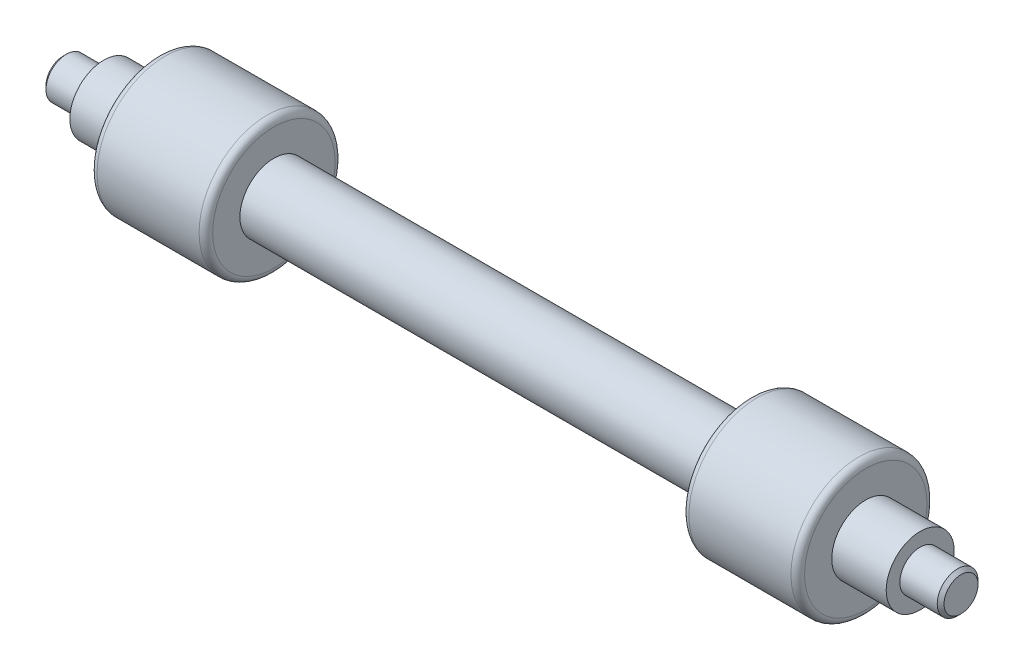
ISO-10303-21;
HEADER;
FILE_DESCRIPTION(('STEP AP214'),'2;1');
FILE_NAME('part.step','',(''),(''),'','','');
FILE_SCHEMA(('AUTOMOTIVE_DESIGN { 1 0 10303 214 1 1 1 1 }'));
ENDSEC;
DATA;
#1=APPLICATION_CONTEXT('core data for automotive mechanical design processes');
#2=APPLICATION_PROTOCOL_DEFINITION('international standard','automotive_design',2000,#1);
#3=PRODUCT_CONTEXT('',#1,'mechanical');
#4=PRODUCT('Part','Part','',(#3));
#5=PRODUCT_RELATED_PRODUCT_CATEGORY('part','',(#4));
#6=PRODUCT_DEFINITION_FORMATION('','',#4);
#7=PRODUCT_DEFINITION_CONTEXT('part definition',#1,'design');
#8=PRODUCT_DEFINITION('design','',#6,#7);
#9=PRODUCT_DEFINITION_SHAPE('','',#8);
#10=(LENGTH_UNIT() NAMED_UNIT(*) SI_UNIT(.MILLI.,.METRE.));
#11=(NAMED_UNIT(*) PLANE_ANGLE_UNIT() SI_UNIT($,.RADIAN.));
#12=(NAMED_UNIT(*) SI_UNIT($,.STERADIAN.) SOLID_ANGLE_UNIT());
#13=UNCERTAINTY_MEASURE_WITH_UNIT(LENGTH_MEASURE(1.E-05),#10,'distance_accuracy_value','');
#14=(GEOMETRIC_REPRESENTATION_CONTEXT(3) GLOBAL_UNCERTAINTY_ASSIGNED_CONTEXT((#13)) GLOBAL_UNIT_ASSIGNED_CONTEXT((#10,
#11,#12)) REPRESENTATION_CONTEXT('',''));
#15=CARTESIAN_POINT('',(0.,0.,0.));
#16=DIRECTION('',(0.,0.,1.));
#17=DIRECTION('',(1.,0.,0.));
#18=AXIS2_PLACEMENT_3D('',#15,#16,#17);
#19=CARTESIAN_POINT('',(-35.8089771432617,0.,0.));
#20=DIRECTION('',(-1.,0.,0.));
#21=DIRECTION('',(0.,0.,1.));
#22=AXIS2_PLACEMENT_3D('',#19,#20,#21);
#23=CYLINDRICAL_SURFACE('',#22,2.5);
#24=CARTESIAN_POINT('',(26.,0.,0.));
#25=DIRECTION('',(-1.,0.,0.));
#26=DIRECTION('',(0.,0.,1.));
#27=AXIS2_PLACEMENT_3D('',#24,#25,#26);
#28=CIRCLE('',#27,2.5);
#29=CARTESIAN_POINT('',(26.,0.,2.5));
#30=VERTEX_POINT('',#29);
#31=EDGE_CURVE('E79',#30,#30,#28,.T.);
#32=ORIENTED_EDGE('',*,*,#31,.F.);
#33=EDGE_LOOP('',(#32));
#34=FACE_BOUND('',#33,.T.);
#35=CARTESIAN_POINT('',(17.5,0.,0.));
#36=DIRECTION('',(-1.,0.,0.));
#37=DIRECTION('',(0.,0.,1.));
#38=AXIS2_PLACEMENT_3D('',#35,#36,#37);
#39=CIRCLE('',#38,2.5);
#40=CARTESIAN_POINT('',(17.5,0.,2.5));
#41=VERTEX_POINT('',#40);
#42=EDGE_CURVE('E76',#41,#41,#39,.T.);
#43=ORIENTED_EDGE('',*,*,#42,.T.);
#44=EDGE_LOOP('',(#43));
#45=FACE_BOUND('',#44,.T.);
#46=ADVANCED_FACE('F56',(#34,#45),#23,.F.);
#47=CARTESIAN_POINT('',(17.5,2.5,0.));
#48=DIRECTION('',(1.,0.,0.));
#49=DIRECTION('',(0.,0.,-1.));
#50=AXIS2_PLACEMENT_3D('',#47,#48,#49);
#51=PLANE('',#50);
#52=CARTESIAN_POINT('',(17.5,0.,0.));
#53=DIRECTION('',(1.,0.,0.));
#54=DIRECTION('',(0.,0.,-1.));
#55=AXIS2_PLACEMENT_3D('',#52,#53,#54);
#56=CIRCLE('',#55,4.5);
#57=CARTESIAN_POINT('',(17.5,0.,-4.5));
#58=VERTEX_POINT('',#57);
#59=EDGE_CURVE('E71',#58,#58,#56,.F.);
#60=ORIENTED_EDGE('',*,*,#59,.T.);
#61=EDGE_LOOP('',(#60));
#62=FACE_BOUND('',#61,.T.);
#63=ORIENTED_EDGE('',*,*,#42,.F.);
#64=EDGE_LOOP('',(#63));
#65=FACE_BOUND('',#64,.T.);
#66=ADVANCED_FACE('F87',(#62,#65),#51,.F.);
#67=CARTESIAN_POINT('',(-35.8089771432617,0.,0.));
#68=DIRECTION('',(-1.,0.,0.));
#69=DIRECTION('',(0.,0.,1.));
#70=AXIS2_PLACEMENT_3D('',#67,#68,#69);
#71=CYLINDRICAL_SURFACE('',#70,5.);
#72=CARTESIAN_POINT('',(18.,0.,0.));
#73=DIRECTION('',(1.,0.,0.));
#74=DIRECTION('',(0.,0.,-1.));
#75=AXIS2_PLACEMENT_3D('',#72,#73,#74);
#76=CIRCLE('',#75,5.);
#77=CARTESIAN_POINT('',(18.,0.,-5.));
#78=VERTEX_POINT('',#77);
#79=EDGE_CURVE('E63',#78,#78,#76,.T.);
#80=ORIENTED_EDGE('',*,*,#79,.T.);
#81=EDGE_LOOP('',(#80));
#82=FACE_BOUND('',#81,.T.);
#83=CARTESIAN_POINT('',(25.5,0.,0.));
#84=DIRECTION('',(-1.,0.,0.));
#85=DIRECTION('',(0.,0.,1.));
#86=AXIS2_PLACEMENT_3D('',#83,#84,#85);
#87=CIRCLE('',#86,5.);
#88=CARTESIAN_POINT('',(25.5,0.,5.));
#89=VERTEX_POINT('',#88);
#90=EDGE_CURVE('E67',#89,#89,#87,.T.);
#91=ORIENTED_EDGE('',*,*,#90,.T.);
#92=EDGE_LOOP('',(#91));
#93=FACE_BOUND('',#92,.T.);
#94=ADVANCED_FACE('F92',(#82,#93),#71,.T.);
#95=CARTESIAN_POINT('',(26.,5.,0.));
#96=DIRECTION('',(-1.,0.,0.));
#97=DIRECTION('',(0.,0.,1.));
#98=AXIS2_PLACEMENT_3D('',#95,#96,#97);
#99=PLANE('',#98);
#100=CARTESIAN_POINT('',(26.,0.,0.));
#101=DIRECTION('',(-1.,0.,0.));
#102=DIRECTION('',(0.,0.,1.));
#103=AXIS2_PLACEMENT_3D('',#100,#101,#102);
#104=CIRCLE('',#103,4.5);
#105=CARTESIAN_POINT('',(26.,0.,4.5));
#106=VERTEX_POINT('',#105);
#107=EDGE_CURVE('E11',#106,#106,#104,.F.);
#108=ORIENTED_EDGE('',*,*,#107,.T.);
#109=EDGE_LOOP('',(#108));
#110=FACE_BOUND('',#109,.T.);
#111=ORIENTED_EDGE('',*,*,#31,.T.);
#112=EDGE_LOOP('',(#111));
#113=FACE_BOUND('',#112,.T.);
#114=ADVANCED_FACE('F83',(#110,#113),#99,.F.);
#115=CARTESIAN_POINT('',(18.,0.,0.));
#116=DIRECTION('',(1.,0.,0.));
#117=DIRECTION('',(0.,0.,-1.));
#118=AXIS2_PLACEMENT_3D('',#115,#116,#117);
#119=TOROIDAL_SURFACE('',#118,4.5,0.5);
#120=ORIENTED_EDGE('',*,*,#79,.F.);
#121=EDGE_LOOP('',(#120));
#122=FACE_BOUND('',#121,.T.);
#123=ORIENTED_EDGE('',*,*,#59,.F.);
#124=EDGE_LOOP('',(#123));
#125=FACE_BOUND('',#124,.T.);
#126=ADVANCED_FACE('F100',(#122,#125),#119,.T.);
#127=CARTESIAN_POINT('',(25.5,0.,0.));
#128=DIRECTION('',(-1.,0.,0.));
#129=DIRECTION('',(0.,0.,1.));
#130=AXIS2_PLACEMENT_3D('',#127,#128,#129);
#131=TOROIDAL_SURFACE('',#130,4.5,0.5);
#132=ORIENTED_EDGE('',*,*,#107,.F.);
#133=EDGE_LOOP('',(#132));
#134=FACE_BOUND('',#133,.T.);
#135=ORIENTED_EDGE('',*,*,#90,.F.);
#136=EDGE_LOOP('',(#135));
#137=FACE_BOUND('',#136,.T.);
#138=ADVANCED_FACE('F58',(#134,#137),#131,.T.);
#139=CLOSED_SHELL('',(#46,#66,#94,#114,#126,#138));
#140=MANIFOLD_SOLID_BREP('B2',#139);
#141=CARTESIAN_POINT('',(-35.8089771432617,0.,0.));
#142=DIRECTION('',(-1.,0.,0.));
#143=DIRECTION('',(0.,0.,1.));
#144=AXIS2_PLACEMENT_3D('',#141,#142,#143);
#145=CYLINDRICAL_SURFACE('',#144,2.5);
#146=CARTESIAN_POINT('',(-17.5,0.,0.));
#147=DIRECTION('',(-1.,0.,0.));
#148=DIRECTION('',(0.,0.,1.));
#149=AXIS2_PLACEMENT_3D('',#146,#147,#148);
#150=CIRCLE('',#149,2.5);
#151=CARTESIAN_POINT('',(-17.5,0.,2.5));
#152=VERTEX_POINT('',#151);
#153=EDGE_CURVE('E190',#152,#152,#150,.T.);
#154=ORIENTED_EDGE('',*,*,#153,.F.);
#155=EDGE_LOOP('',(#154));
#156=FACE_BOUND('',#155,.T.);
#157=CARTESIAN_POINT('',(-26.,0.,0.));
#158=DIRECTION('',(-1.,0.,0.));
#159=DIRECTION('',(0.,0.,1.));
#160=AXIS2_PLACEMENT_3D('',#157,#158,#159);
#161=CIRCLE('',#160,2.5);
#162=CARTESIAN_POINT('',(-26.,0.,2.5));
#163=VERTEX_POINT('',#162);
#164=EDGE_CURVE('E187',#163,#163,#161,.T.);
#165=ORIENTED_EDGE('',*,*,#164,.T.);
#166=EDGE_LOOP('',(#165));
#167=FACE_BOUND('',#166,.T.);
#168=ADVANCED_FACE('F167',(#156,#167),#145,.F.);
#169=CARTESIAN_POINT('',(-26.,2.5,0.));
#170=DIRECTION('',(1.,0.,0.));
#171=DIRECTION('',(0.,0.,-1.));
#172=AXIS2_PLACEMENT_3D('',#169,#170,#171);
#173=PLANE('',#172);
#174=CARTESIAN_POINT('',(-26.,0.,0.));
#175=DIRECTION('',(1.,0.,0.));
#176=DIRECTION('',(0.,0.,-1.));
#177=AXIS2_PLACEMENT_3D('',#174,#175,#176);
#178=CIRCLE('',#177,4.5);
#179=CARTESIAN_POINT('',(-26.,0.,-4.5));
#180=VERTEX_POINT('',#179);
#181=EDGE_CURVE('E55',#180,#180,#178,.F.);
#182=ORIENTED_EDGE('',*,*,#181,.T.);
#183=EDGE_LOOP('',(#182));
#184=FACE_BOUND('',#183,.T.);
#185=ORIENTED_EDGE('',*,*,#164,.F.);
#186=EDGE_LOOP('',(#185));
#187=FACE_BOUND('',#186,.T.);
#188=ADVANCED_FACE('F198',(#184,#187),#173,.F.);
#189=CARTESIAN_POINT('',(-35.8089771432617,0.,0.));
#190=DIRECTION('',(-1.,0.,0.));
#191=DIRECTION('',(0.,0.,1.));
#192=AXIS2_PLACEMENT_3D('',#189,#190,#191);
#193=CYLINDRICAL_SURFACE('',#192,5.);
#194=CARTESIAN_POINT('',(-18.,0.,0.));
#195=DIRECTION('',(-1.,0.,0.));
#196=DIRECTION('',(0.,0.,1.));
#197=AXIS2_PLACEMENT_3D('',#194,#195,#196);
#198=CIRCLE('',#197,5.);
#199=CARTESIAN_POINT('',(-18.,0.,5.));
#200=VERTEX_POINT('',#199);
#201=EDGE_CURVE('E178',#200,#200,#198,.T.);
#202=ORIENTED_EDGE('',*,*,#201,.T.);
#203=EDGE_LOOP('',(#202));
#204=FACE_BOUND('',#203,.T.);
#205=CARTESIAN_POINT('',(-25.5,0.,0.));
#206=DIRECTION('',(1.,0.,0.));
#207=DIRECTION('',(0.,0.,-1.));
#208=AXIS2_PLACEMENT_3D('',#205,#206,#207);
#209=CIRCLE('',#208,5.);
#210=CARTESIAN_POINT('',(-25.5,0.,-5.));
#211=VERTEX_POINT('',#210);
#212=EDGE_CURVE('E182',#211,#211,#209,.T.);
#213=ORIENTED_EDGE('',*,*,#212,.T.);
#214=EDGE_LOOP('',(#213));
#215=FACE_BOUND('',#214,.T.);
#216=ADVANCED_FACE('F203',(#204,#215),#193,.T.);
#217=CARTESIAN_POINT('',(-17.5,5.,0.));
#218=DIRECTION('',(-1.,0.,0.));
#219=DIRECTION('',(0.,0.,1.));
#220=AXIS2_PLACEMENT_3D('',#217,#218,#219);
#221=PLANE('',#220);
#222=CARTESIAN_POINT('',(-17.5,0.,0.));
#223=DIRECTION('',(-1.,0.,0.));
#224=DIRECTION('',(0.,0.,1.));
#225=AXIS2_PLACEMENT_3D('',#222,#223,#224);
#226=CIRCLE('',#225,4.5);
#227=CARTESIAN_POINT('',(-17.5,0.,4.5));
#228=VERTEX_POINT('',#227);
#229=EDGE_CURVE('E174',#228,#228,#226,.F.);
#230=ORIENTED_EDGE('',*,*,#229,.T.);
#231=EDGE_LOOP('',(#230));
#232=FACE_BOUND('',#231,.T.);
#233=ORIENTED_EDGE('',*,*,#153,.T.);
#234=EDGE_LOOP('',(#233));
#235=FACE_BOUND('',#234,.T.);
#236=ADVANCED_FACE('F194',(#232,#235),#221,.F.);
#237=CARTESIAN_POINT('',(-18.,0.,0.));
#238=DIRECTION('',(-1.,0.,0.));
#239=DIRECTION('',(0.,0.,1.));
#240=AXIS2_PLACEMENT_3D('',#237,#238,#239);
#241=TOROIDAL_SURFACE('',#240,4.5,0.5);
#242=ORIENTED_EDGE('',*,*,#229,.F.);
#243=EDGE_LOOP('',(#242));
#244=FACE_BOUND('',#243,.T.);
#245=ORIENTED_EDGE('',*,*,#201,.F.);
#246=EDGE_LOOP('',(#245));
#247=FACE_BOUND('',#246,.T.);
#248=ADVANCED_FACE('F211',(#244,#247),#241,.T.);
#249=CARTESIAN_POINT('',(-25.5,0.,0.));
#250=DIRECTION('',(1.,0.,0.));
#251=DIRECTION('',(0.,0.,-1.));
#252=AXIS2_PLACEMENT_3D('',#249,#250,#251);
#253=TOROIDAL_SURFACE('',#252,4.5,0.5);
#254=ORIENTED_EDGE('',*,*,#212,.F.);
#255=EDGE_LOOP('',(#254));
#256=FACE_BOUND('',#255,.T.);
#257=ORIENTED_EDGE('',*,*,#181,.F.);
#258=EDGE_LOOP('',(#257));
#259=FACE_BOUND('',#258,.T.);
#260=ADVANCED_FACE('F169',(#256,#259),#253,.T.);
#261=CLOSED_SHELL('',(#168,#188,#216,#236,#248,#260));
#262=MANIFOLD_SOLID_BREP('B6',#261);
#263=CARTESIAN_POINT('',(33.,0.,0.));
#264=DIRECTION('',(-1.,0.,0.));
#265=DIRECTION('',(0.,0.,1.));
#266=AXIS2_PLACEMENT_3D('',#263,#264,#265);
#267=PLANE('',#266);
#268=CARTESIAN_POINT('',(33.,0.,0.));
#269=DIRECTION('',(-1.,0.,0.));
#270=DIRECTION('',(0.,0.,1.));
#271=AXIS2_PLACEMENT_3D('',#268,#269,#270);
#272=CIRCLE('',#271,1.24999999999999);
#273=CARTESIAN_POINT('',(33.,0.,1.24999999999999));
#274=VERTEX_POINT('',#273);
#275=EDGE_CURVE('E284',#274,#274,#272,.F.);
#276=ORIENTED_EDGE('',*,*,#275,.T.);
#277=EDGE_LOOP('',(#276));
#278=FACE_BOUND('',#277,.T.);
#279=ADVANCED_FACE('F270',(#278),#267,.F.);
#280=CARTESIAN_POINT('',(-35.8089771432617,0.,0.));
#281=DIRECTION('',(-1.,0.,0.));
#282=DIRECTION('',(0.,0.,1.));
#283=AXIS2_PLACEMENT_3D('',#280,#281,#282);
#284=CYLINDRICAL_SURFACE('',#283,1.5);
#285=CARTESIAN_POINT('',(32.75,0.,0.));
#286=DIRECTION('',(-1.,0.,0.));
#287=DIRECTION('',(0.,0.,1.));
#288=AXIS2_PLACEMENT_3D('',#285,#286,#287);
#289=CIRCLE('',#288,1.5);
#290=CARTESIAN_POINT('',(32.75,0.,1.5));
#291=VERTEX_POINT('',#290);
#292=EDGE_CURVE('E289',#291,#291,#289,.T.);
#293=ORIENTED_EDGE('',*,*,#292,.T.);
#294=EDGE_LOOP('',(#293));
#295=FACE_BOUND('',#294,.T.);
#296=CARTESIAN_POINT('',(30.,0.,0.));
#297=DIRECTION('',(-1.,0.,0.));
#298=DIRECTION('',(0.,0.,1.));
#299=AXIS2_PLACEMENT_3D('',#296,#297,#298);
#300=CIRCLE('',#299,1.5);
#301=CARTESIAN_POINT('',(30.,0.,1.5));
#302=VERTEX_POINT('',#301);
#303=EDGE_CURVE('E295',#302,#302,#300,.T.);
#304=ORIENTED_EDGE('',*,*,#303,.F.);
#305=EDGE_LOOP('',(#304));
#306=FACE_BOUND('',#305,.T.);
#307=ADVANCED_FACE('F329',(#295,#306),#284,.T.);
#308=CARTESIAN_POINT('',(30.,1.5,0.));
#309=DIRECTION('',(-1.,0.,0.));
#310=DIRECTION('',(0.,0.,1.));
#311=AXIS2_PLACEMENT_3D('',#308,#309,#310);
#312=PLANE('',#311);
#313=CARTESIAN_POINT('',(30.,0.,0.));
#314=DIRECTION('',(-1.,0.,0.));
#315=DIRECTION('',(0.,0.,1.));
#316=AXIS2_PLACEMENT_3D('',#313,#314,#315);
#317=CIRCLE('',#316,2.5);
#318=CARTESIAN_POINT('',(30.,0.,2.5));
#319=VERTEX_POINT('',#318);
#320=EDGE_CURVE('E299',#319,#319,#317,.T.);
#321=ORIENTED_EDGE('',*,*,#320,.F.);
#322=EDGE_LOOP('',(#321));
#323=FACE_BOUND('',#322,.T.);
#324=ORIENTED_EDGE('',*,*,#303,.T.);
#325=EDGE_LOOP('',(#324));
#326=FACE_BOUND('',#325,.T.);
#327=ADVANCED_FACE('F323',(#323,#326),#312,.F.);
#328=CARTESIAN_POINT('',(-35.8089771432617,0.,0.));
#329=DIRECTION('',(-1.,0.,0.));
#330=DIRECTION('',(0.,0.,1.));
#331=AXIS2_PLACEMENT_3D('',#328,#329,#330);
#332=CYLINDRICAL_SURFACE('',#331,2.5);
#333=CARTESIAN_POINT('',(-30.,0.,0.));
#334=DIRECTION('',(-1.,0.,0.));
#335=DIRECTION('',(0.,0.,1.));
#336=AXIS2_PLACEMENT_3D('',#333,#334,#335);
#337=CIRCLE('',#336,2.5);
#338=CARTESIAN_POINT('',(-30.,0.,2.5));
#339=VERTEX_POINT('',#338);
#340=EDGE_CURVE('E303',#339,#339,#337,.T.);
#341=ORIENTED_EDGE('',*,*,#340,.F.);
#342=EDGE_LOOP('',(#341));
#343=FACE_BOUND('',#342,.T.);
#344=ORIENTED_EDGE('',*,*,#320,.T.);
#345=EDGE_LOOP('',(#344));
#346=FACE_BOUND('',#345,.T.);
#347=ADVANCED_FACE('F317',(#343,#346),#332,.T.);
#348=CARTESIAN_POINT('',(-30.,2.5,0.));
#349=DIRECTION('',(1.,0.,0.));
#350=DIRECTION('',(0.,0.,-1.));
#351=AXIS2_PLACEMENT_3D('',#348,#349,#350);
#352=PLANE('',#351);
#353=CARTESIAN_POINT('',(-30.,0.,0.));
#354=DIRECTION('',(-1.,0.,0.));
#355=DIRECTION('',(0.,0.,1.));
#356=AXIS2_PLACEMENT_3D('',#353,#354,#355);
#357=CIRCLE('',#356,1.5);
#358=CARTESIAN_POINT('',(-30.,0.,1.5));
#359=VERTEX_POINT('',#358);
#360=EDGE_CURVE('E307',#359,#359,#357,.T.);
#361=ORIENTED_EDGE('',*,*,#360,.F.);
#362=EDGE_LOOP('',(#361));
#363=FACE_BOUND('',#362,.T.);
#364=ORIENTED_EDGE('',*,*,#340,.T.);
#365=EDGE_LOOP('',(#364));
#366=FACE_BOUND('',#365,.T.);
#367=ADVANCED_FACE('F314',(#363,#366),#352,.F.);
#368=CARTESIAN_POINT('',(-35.8089771432617,0.,0.));
#369=DIRECTION('',(-1.,0.,0.));
#370=DIRECTION('',(0.,0.,1.));
#371=AXIS2_PLACEMENT_3D('',#368,#369,#370);
#372=CYLINDRICAL_SURFACE('',#371,1.5);
#373=CARTESIAN_POINT('',(-32.75,0.,0.));
#374=DIRECTION('',(1.,0.,0.));
#375=DIRECTION('',(0.,0.,-1.));
#376=AXIS2_PLACEMENT_3D('',#373,#374,#375);
#377=CIRCLE('',#376,1.5);
#378=CARTESIAN_POINT('',(-32.75,0.,-1.5));
#379=VERTEX_POINT('',#378);
#380=EDGE_CURVE('E166',#379,#379,#377,.T.);
#381=ORIENTED_EDGE('',*,*,#380,.T.);
#382=EDGE_LOOP('',(#381));
#383=FACE_BOUND('',#382,.T.);
#384=ORIENTED_EDGE('',*,*,#360,.T.);
#385=EDGE_LOOP('',(#384));
#386=FACE_BOUND('',#385,.T.);
#387=ADVANCED_FACE('F312',(#383,#386),#372,.T.);
#388=CARTESIAN_POINT('',(-33.,1.5,0.));
#389=DIRECTION('',(1.,0.,0.));
#390=DIRECTION('',(0.,0.,-1.));
#391=AXIS2_PLACEMENT_3D('',#388,#389,#390);
#392=PLANE('',#391);
#393=CARTESIAN_POINT('',(-33.,0.,0.));
#394=DIRECTION('',(1.,0.,0.));
#395=DIRECTION('',(0.,0.,-1.));
#396=AXIS2_PLACEMENT_3D('',#393,#394,#395);
#397=CIRCLE('',#396,1.25000000000002);
#398=CARTESIAN_POINT('',(-33.,0.,-1.25000000000002));
#399=VERTEX_POINT('',#398);
#400=EDGE_CURVE('E279',#399,#399,#397,.F.);
#401=ORIENTED_EDGE('',*,*,#400,.T.);
#402=EDGE_LOOP('',(#401));
#403=FACE_BOUND('',#402,.T.);
#404=ADVANCED_FACE('F346',(#403),#392,.F.);
#405=CARTESIAN_POINT('',(32.75,0.,0.));
#406=DIRECTION('',(-1.,0.,0.));
#407=DIRECTION('',(0.,0.,1.));
#408=AXIS2_PLACEMENT_3D('',#405,#406,#407);
#409=CONICAL_SURFACE('',#408,1.5,0.78539816339745);
#410=ORIENTED_EDGE('',*,*,#275,.F.);
#411=EDGE_LOOP('',(#410));
#412=FACE_BOUND('',#411,.T.);
#413=ORIENTED_EDGE('',*,*,#292,.F.);
#414=EDGE_LOOP('',(#413));
#415=FACE_BOUND('',#414,.T.);
#416=ADVANCED_FACE('F342',(#412,#415),#409,.T.);
#417=CARTESIAN_POINT('',(-33.,0.,0.));
#418=DIRECTION('',(1.,0.,0.));
#419=DIRECTION('',(0.,0.,-1.));
#420=AXIS2_PLACEMENT_3D('',#417,#418,#419);
#421=CONICAL_SURFACE('',#420,1.25000000000002,0.785398163397437);
#422=ORIENTED_EDGE('',*,*,#380,.F.);
#423=EDGE_LOOP('',(#422));
#424=FACE_BOUND('',#423,.T.);
#425=ORIENTED_EDGE('',*,*,#400,.F.);
#426=EDGE_LOOP('',(#425));
#427=FACE_BOUND('',#426,.T.);
#428=ADVANCED_FACE('F273',(#424,#427),#421,.T.);
#429=CLOSED_SHELL('',(#279,#307,#327,#347,#367,#387,#404,#416,#428));
#430=MANIFOLD_SOLID_BREP('B50',#429);
#431=ADVANCED_BREP_SHAPE_REPRESENTATION('',(#18,#140,#262,#430),#14);
#432=SHAPE_DEFINITION_REPRESENTATION(#9,#431);
ENDSEC;
END-ISO-10303-21;
